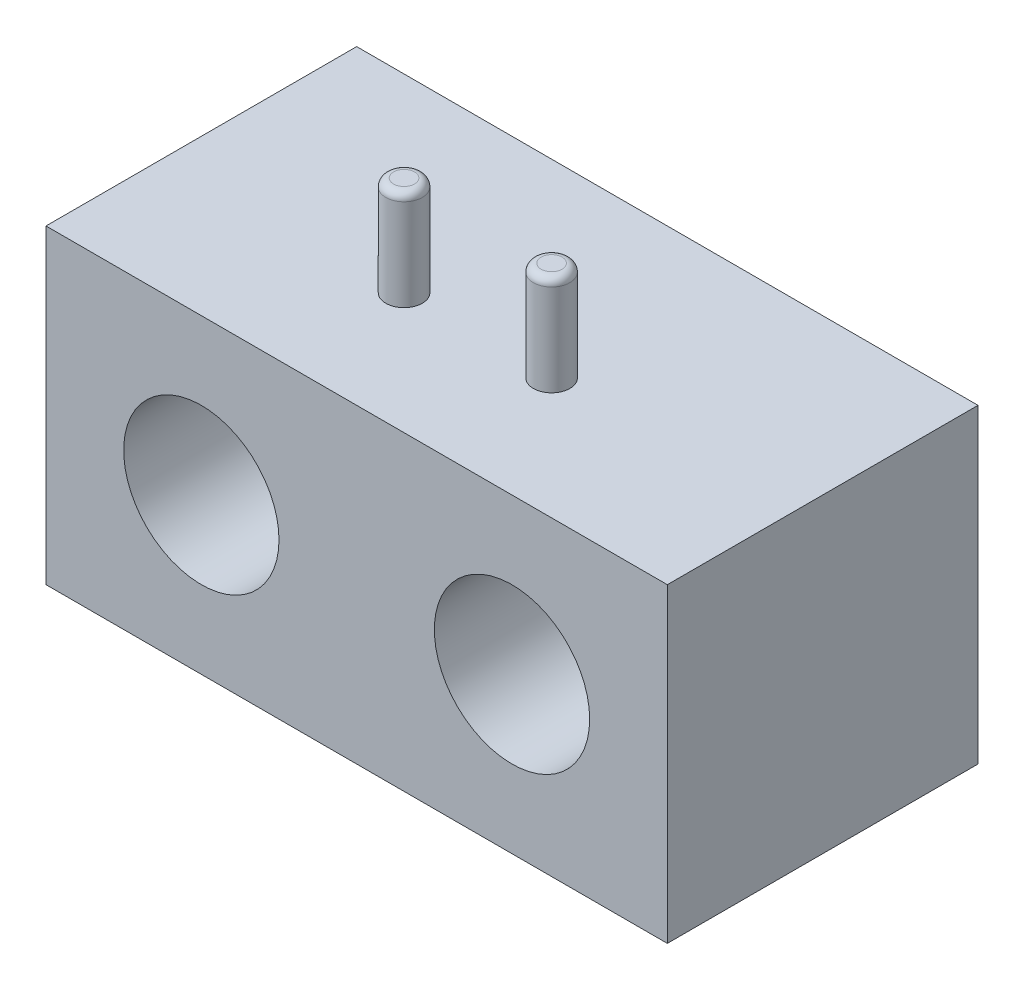
ISO-10303-21;
HEADER;
FILE_DESCRIPTION(('STEP AP214'),'2;1');
FILE_NAME('part.step','',(''),(''),'','','');
FILE_SCHEMA(('AUTOMOTIVE_DESIGN { 1 0 10303 214 1 1 1 1 }'));
ENDSEC;
DATA;
#1=APPLICATION_CONTEXT('core data for automotive mechanical design processes');
#2=APPLICATION_PROTOCOL_DEFINITION('international standard','automotive_design',2000,#1);
#3=PRODUCT_CONTEXT('',#1,'mechanical');
#4=PRODUCT('Part','Part','',(#3));
#5=PRODUCT_RELATED_PRODUCT_CATEGORY('part','',(#4));
#6=PRODUCT_DEFINITION_FORMATION('','',#4);
#7=PRODUCT_DEFINITION_CONTEXT('part definition',#1,'design');
#8=PRODUCT_DEFINITION('design','',#6,#7);
#9=PRODUCT_DEFINITION_SHAPE('','',#8);
#10=(LENGTH_UNIT() NAMED_UNIT(*) SI_UNIT(.MILLI.,.METRE.));
#11=(NAMED_UNIT(*) PLANE_ANGLE_UNIT() SI_UNIT($,.RADIAN.));
#12=(NAMED_UNIT(*) SI_UNIT($,.STERADIAN.) SOLID_ANGLE_UNIT());
#13=UNCERTAINTY_MEASURE_WITH_UNIT(LENGTH_MEASURE(1.E-05),#10,'distance_accuracy_value','');
#14=(GEOMETRIC_REPRESENTATION_CONTEXT(3) GLOBAL_UNCERTAINTY_ASSIGNED_CONTEXT((#13)) GLOBAL_UNIT_ASSIGNED_CONTEXT((#10,
#11,#12)) REPRESENTATION_CONTEXT('',''));
#15=CARTESIAN_POINT('',(0.,0.,0.));
#16=DIRECTION('',(0.,0.,1.));
#17=DIRECTION('',(1.,0.,0.));
#18=AXIS2_PLACEMENT_3D('',#15,#16,#17);
#19=CARTESIAN_POINT('',(-4.776,11.36,20.));
#20=DIRECTION('',(0.,0.,-1.));
#21=DIRECTION('',(-1.,0.,0.));
#22=AXIS2_PLACEMENT_3D('',#19,#20,#21);
#23=CYLINDRICAL_SURFACE('',#22,2.5);
#24=CARTESIAN_POINT('',(-4.776,11.36,0.));
#25=DIRECTION('',(0.,0.,1.));
#26=DIRECTION('',(1.,0.,0.));
#27=AXIS2_PLACEMENT_3D('',#24,#25,#26);
#28=CIRCLE('',#27,2.5);
#29=CARTESIAN_POINT('',(-2.276,11.36,0.));
#30=VERTEX_POINT('',#29);
#31=EDGE_CURVE('E118',#30,#30,#28,.T.);
#32=ORIENTED_EDGE('',*,*,#31,.F.);
#33=EDGE_LOOP('',(#32));
#34=FACE_BOUND('',#33,.T.);
#35=CARTESIAN_POINT('',(-4.776,11.36,2.));
#36=DIRECTION('',(0.,0.,1.));
#37=DIRECTION('',(1.,0.,0.));
#38=AXIS2_PLACEMENT_3D('',#35,#36,#37);
#39=CIRCLE('',#38,2.5);
#40=CARTESIAN_POINT('',(-2.276,11.36,2.));
#41=VERTEX_POINT('',#40);
#42=EDGE_CURVE('E136',#41,#41,#39,.T.);
#43=ORIENTED_EDGE('',*,*,#42,.T.);
#44=EDGE_LOOP('',(#43));
#45=FACE_BOUND('',#44,.T.);
#46=ADVANCED_FACE('F41',(#34,#45),#23,.F.);
#47=CARTESIAN_POINT('',(15.224,11.36,20.));
#48=DIRECTION('',(0.,0.,-1.));
#49=DIRECTION('',(-1.,0.,0.));
#50=AXIS2_PLACEMENT_3D('',#47,#48,#49);
#51=CYLINDRICAL_SURFACE('',#50,2.5);
#52=CARTESIAN_POINT('',(15.224,11.36,0.));
#53=DIRECTION('',(0.,0.,1.));
#54=DIRECTION('',(1.,0.,0.));
#55=AXIS2_PLACEMENT_3D('',#52,#53,#54);
#56=CIRCLE('',#55,2.5);
#57=CARTESIAN_POINT('',(17.724,11.36,0.));
#58=VERTEX_POINT('',#57);
#59=EDGE_CURVE('E141',#58,#58,#56,.T.);
#60=ORIENTED_EDGE('',*,*,#59,.F.);
#61=EDGE_LOOP('',(#60));
#62=FACE_BOUND('',#61,.T.);
#63=CARTESIAN_POINT('',(15.224,11.36,2.));
#64=DIRECTION('',(0.,0.,1.));
#65=DIRECTION('',(1.,0.,0.));
#66=AXIS2_PLACEMENT_3D('',#63,#64,#65);
#67=CIRCLE('',#66,2.5);
#68=CARTESIAN_POINT('',(17.724,11.36,2.));
#69=VERTEX_POINT('',#68);
#70=EDGE_CURVE('E132',#69,#69,#67,.T.);
#71=ORIENTED_EDGE('',*,*,#70,.T.);
#72=EDGE_LOOP('',(#71));
#73=FACE_BOUND('',#72,.T.);
#74=ADVANCED_FACE('F172',(#62,#73),#51,.F.);
#75=CARTESIAN_POINT('',(0.,0.,20.));
#76=DIRECTION('',(0.,0.,1.));
#77=DIRECTION('',(1.,0.,0.));
#78=AXIS2_PLACEMENT_3D('',#75,#76,#77);
#79=PLANE('',#78);
#80=CARTESIAN_POINT('',(-4.776,11.36,20.));
#81=DIRECTION('',(0.,0.,1.));
#82=DIRECTION('',(1.,0.,0.));
#83=AXIS2_PLACEMENT_3D('',#80,#81,#82);
#84=CIRCLE('',#83,5.);
#85=CARTESIAN_POINT('',(0.223999999999997,11.36,20.));
#86=VERTEX_POINT('',#85);
#87=EDGE_CURVE('E221',#86,#86,#84,.T.);
#88=ORIENTED_EDGE('',*,*,#87,.F.);
#89=EDGE_LOOP('',(#88));
#90=FACE_BOUND('',#89,.T.);
#91=CARTESIAN_POINT('',(15.224,11.36,20.));
#92=DIRECTION('',(0.,0.,1.));
#93=DIRECTION('',(1.,0.,0.));
#94=AXIS2_PLACEMENT_3D('',#91,#92,#93);
#95=CIRCLE('',#94,5.);
#96=CARTESIAN_POINT('',(20.224,11.36,20.));
#97=VERTEX_POINT('',#96);
#98=EDGE_CURVE('E222',#97,#97,#95,.T.);
#99=ORIENTED_EDGE('',*,*,#98,.F.);
#100=EDGE_LOOP('',(#99));
#101=FACE_BOUND('',#100,.T.);
#102=DIRECTION('',(0.,-1.,0.));
#103=VECTOR('',#102,1.);
#104=CARTESIAN_POINT('',(-14.776,21.36,20.));
#105=LINE('',#104,#103);
#106=CARTESIAN_POINT('',(-14.776,21.36,20.));
#107=VERTEX_POINT('',#106);
#108=CARTESIAN_POINT('',(-14.776,1.36,20.));
#109=VERTEX_POINT('',#108);
#110=EDGE_CURVE('E95',#107,#109,#105,.T.);
#111=ORIENTED_EDGE('',*,*,#110,.T.);
#112=DIRECTION('',(1.,0.,0.));
#113=VECTOR('',#112,1.);
#114=CARTESIAN_POINT('',(-14.776,1.36,20.));
#115=LINE('',#114,#113);
#116=CARTESIAN_POINT('',(25.224,1.36,20.));
#117=VERTEX_POINT('',#116);
#118=EDGE_CURVE('E90',#109,#117,#115,.T.);
#119=ORIENTED_EDGE('',*,*,#118,.T.);
#120=DIRECTION('',(0.,1.,0.));
#121=VECTOR('',#120,1.);
#122=CARTESIAN_POINT('',(25.224,21.36,20.));
#123=LINE('',#122,#121);
#124=CARTESIAN_POINT('',(25.224,21.36,20.));
#125=VERTEX_POINT('',#124);
#126=EDGE_CURVE('E93',#117,#125,#123,.T.);
#127=ORIENTED_EDGE('',*,*,#126,.T.);
#128=DIRECTION('',(-1.,0.,0.));
#129=VECTOR('',#128,1.);
#130=CARTESIAN_POINT('',(-14.776,21.36,20.));
#131=LINE('',#130,#129);
#132=EDGE_CURVE('E59',#125,#107,#131,.T.);
#133=ORIENTED_EDGE('',*,*,#132,.T.);
#134=EDGE_LOOP('',(#111,#119,#127,#133));
#135=FACE_BOUND('',#134,.T.);
#136=ADVANCED_FACE('F91',(#90,#101,#135),#79,.T.);
#137=CARTESIAN_POINT('',(0.,0.,0.));
#138=DIRECTION('',(0.,0.,1.));
#139=DIRECTION('',(1.,0.,0.));
#140=AXIS2_PLACEMENT_3D('',#137,#138,#139);
#141=PLANE('',#140);
#142=DIRECTION('',(0.,-1.,0.));
#143=VECTOR('',#142,1.);
#144=CARTESIAN_POINT('',(-14.776,21.36,0.));
#145=LINE('',#144,#143);
#146=CARTESIAN_POINT('',(-14.776,21.36,0.));
#147=VERTEX_POINT('',#146);
#148=CARTESIAN_POINT('',(-14.776,1.36,0.));
#149=VERTEX_POINT('',#148);
#150=EDGE_CURVE('E114',#147,#149,#145,.T.);
#151=ORIENTED_EDGE('',*,*,#150,.F.);
#152=DIRECTION('',(-1.,0.,0.));
#153=VECTOR('',#152,1.);
#154=CARTESIAN_POINT('',(-14.776,21.36,0.));
#155=LINE('',#154,#153);
#156=CARTESIAN_POINT('',(25.224,21.36,0.));
#157=VERTEX_POINT('',#156);
#158=EDGE_CURVE('E82',#157,#147,#155,.T.);
#159=ORIENTED_EDGE('',*,*,#158,.F.);
#160=DIRECTION('',(0.,1.,0.));
#161=VECTOR('',#160,1.);
#162=CARTESIAN_POINT('',(25.224,21.36,0.));
#163=LINE('',#162,#161);
#164=CARTESIAN_POINT('',(25.224,1.36,0.));
#165=VERTEX_POINT('',#164);
#166=EDGE_CURVE('E76',#165,#157,#163,.T.);
#167=ORIENTED_EDGE('',*,*,#166,.F.);
#168=DIRECTION('',(1.,0.,0.));
#169=VECTOR('',#168,1.);
#170=CARTESIAN_POINT('',(-14.776,1.36,0.));
#171=LINE('',#170,#169);
#172=EDGE_CURVE('E101',#149,#165,#171,.T.);
#173=ORIENTED_EDGE('',*,*,#172,.F.);
#174=EDGE_LOOP('',(#151,#159,#167,#173));
#175=FACE_BOUND('',#174,.T.);
#176=ORIENTED_EDGE('',*,*,#31,.T.);
#177=EDGE_LOOP('',(#176));
#178=FACE_BOUND('',#177,.T.);
#179=ORIENTED_EDGE('',*,*,#59,.T.);
#180=EDGE_LOOP('',(#179));
#181=FACE_BOUND('',#180,.T.);
#182=ADVANCED_FACE('F186',(#175,#178,#181),#141,.F.);
#183=CARTESIAN_POINT('',(-14.776,21.36,20.));
#184=DIRECTION('',(1.,0.,0.));
#185=DIRECTION('',(0.,1.,0.));
#186=AXIS2_PLACEMENT_3D('',#183,#184,#185);
#187=PLANE('',#186);
#188=ORIENTED_EDGE('',*,*,#150,.T.);
#189=DIRECTION('',(0.,0.,-1.));
#190=VECTOR('',#189,1.);
#191=CARTESIAN_POINT('',(-14.776,1.36,20.));
#192=LINE('',#191,#190);
#193=EDGE_CURVE('E103',#109,#149,#192,.T.);
#194=ORIENTED_EDGE('',*,*,#193,.F.);
#195=ORIENTED_EDGE('',*,*,#110,.F.);
#196=DIRECTION('',(0.,0.,-1.));
#197=VECTOR('',#196,1.);
#198=CARTESIAN_POINT('',(-14.776,21.36,20.));
#199=LINE('',#198,#197);
#200=EDGE_CURVE('E110',#107,#147,#199,.T.);
#201=ORIENTED_EDGE('',*,*,#200,.T.);
#202=EDGE_LOOP('',(#188,#194,#195,#201));
#203=FACE_BOUND('',#202,.T.);
#204=ADVANCED_FACE('F190',(#203),#187,.F.);
#205=CARTESIAN_POINT('',(-14.776,1.36,20.));
#206=DIRECTION('',(0.,1.,0.));
#207=DIRECTION('',(0.,0.,1.));
#208=AXIS2_PLACEMENT_3D('',#205,#206,#207);
#209=PLANE('',#208);
#210=ORIENTED_EDGE('',*,*,#172,.T.);
#211=DIRECTION('',(0.,0.,-1.));
#212=VECTOR('',#211,1.);
#213=CARTESIAN_POINT('',(25.224,1.36,20.));
#214=LINE('',#213,#212);
#215=EDGE_CURVE('E99',#117,#165,#214,.T.);
#216=ORIENTED_EDGE('',*,*,#215,.F.);
#217=ORIENTED_EDGE('',*,*,#118,.F.);
#218=ORIENTED_EDGE('',*,*,#193,.T.);
#219=EDGE_LOOP('',(#210,#216,#217,#218));
#220=FACE_BOUND('',#219,.T.);
#221=ADVANCED_FACE('F100',(#220),#209,.F.);
#222=CARTESIAN_POINT('',(25.224,21.36,20.));
#223=DIRECTION('',(-1.,0.,0.));
#224=DIRECTION('',(0.,-1.,0.));
#225=AXIS2_PLACEMENT_3D('',#222,#223,#224);
#226=PLANE('',#225);
#227=ORIENTED_EDGE('',*,*,#166,.T.);
#228=DIRECTION('',(0.,0.,-1.));
#229=VECTOR('',#228,1.);
#230=CARTESIAN_POINT('',(25.224,21.36,20.));
#231=LINE('',#230,#229);
#232=EDGE_CURVE('E104',#125,#157,#231,.T.);
#233=ORIENTED_EDGE('',*,*,#232,.F.);
#234=ORIENTED_EDGE('',*,*,#126,.F.);
#235=ORIENTED_EDGE('',*,*,#215,.T.);
#236=EDGE_LOOP('',(#227,#233,#234,#235));
#237=FACE_BOUND('',#236,.T.);
#238=ADVANCED_FACE('F106',(#237),#226,.F.);
#239=CARTESIAN_POINT('',(-14.776,21.36,20.));
#240=DIRECTION('',(0.,-1.,0.));
#241=DIRECTION('',(0.,0.,-1.));
#242=AXIS2_PLACEMENT_3D('',#239,#240,#241);
#243=PLANE('',#242);
#244=CARTESIAN_POINT('',(0.473999999999995,21.36,12.2));
#245=DIRECTION('',(0.,-1.,0.));
#246=DIRECTION('',(0.,0.,-1.));
#247=AXIS2_PLACEMENT_3D('',#244,#245,#246);
#248=CIRCLE('',#247,1.175);
#249=CARTESIAN_POINT('',(0.473999999999995,21.36,11.025));
#250=VERTEX_POINT('',#249);
#251=EDGE_CURVE('E145',#250,#250,#248,.F.);
#252=ORIENTED_EDGE('',*,*,#251,.F.);
#253=EDGE_LOOP('',(#252));
#254=FACE_BOUND('',#253,.T.);
#255=CARTESIAN_POINT('',(9.974,21.36,12.2));
#256=DIRECTION('',(0.,-1.,0.));
#257=DIRECTION('',(0.,0.,-1.));
#258=AXIS2_PLACEMENT_3D('',#255,#256,#257);
#259=CIRCLE('',#258,1.175);
#260=CARTESIAN_POINT('',(9.974,21.36,11.025));
#261=VERTEX_POINT('',#260);
#262=EDGE_CURVE('E131',#261,#261,#259,.F.);
#263=ORIENTED_EDGE('',*,*,#262,.F.);
#264=EDGE_LOOP('',(#263));
#265=FACE_BOUND('',#264,.T.);
#266=ORIENTED_EDGE('',*,*,#158,.T.);
#267=ORIENTED_EDGE('',*,*,#200,.F.);
#268=ORIENTED_EDGE('',*,*,#132,.F.);
#269=ORIENTED_EDGE('',*,*,#232,.T.);
#270=EDGE_LOOP('',(#266,#267,#268,#269));
#271=FACE_BOUND('',#270,.T.);
#272=ADVANCED_FACE('F192',(#254,#265,#271),#243,.F.);
#273=CARTESIAN_POINT('',(15.224,11.36,-14.142135623731));
#274=DIRECTION('',(0.,0.,1.));
#275=DIRECTION('',(1.,0.,0.));
#276=AXIS2_PLACEMENT_3D('',#273,#274,#275);
#277=CYLINDRICAL_SURFACE('',#276,5.);
#278=CARTESIAN_POINT('',(15.224,11.36,2.));
#279=DIRECTION('',(0.,0.,1.));
#280=DIRECTION('',(1.,0.,0.));
#281=AXIS2_PLACEMENT_3D('',#278,#279,#280);
#282=CIRCLE('',#281,5.);
#283=CARTESIAN_POINT('',(20.224,11.36,1.99999999999999));
#284=VERTEX_POINT('',#283);
#285=EDGE_CURVE('E216',#284,#284,#282,.F.);
#286=CARTESIAN_POINT('',(20.224,11.36,1.99999999999999));
#287=CARTESIAN_POINT('',(20.224,11.36,2.1875));
#288=CARTESIAN_POINT('',(20.224,11.36,2.375));
#289=CARTESIAN_POINT('',(20.224,11.36,2.75));
#290=CARTESIAN_POINT('',(20.224,11.36,2.9375));
#291=CARTESIAN_POINT('',(20.224,11.36,3.3125));
#292=CARTESIAN_POINT('',(20.224,11.36,3.5));
#293=CARTESIAN_POINT('',(20.224,11.36,3.875));
#294=CARTESIAN_POINT('',(20.224,11.36,4.0625));
#295=CARTESIAN_POINT('',(20.224,11.36,4.4375));
#296=CARTESIAN_POINT('',(20.224,11.36,4.62499999999999));
#297=CARTESIAN_POINT('',(20.224,11.36,4.99999999999999));
#298=CARTESIAN_POINT('',(20.224,11.36,5.18749999999999));
#299=CARTESIAN_POINT('',(20.224,11.36,5.56249999999999));
#300=CARTESIAN_POINT('',(20.224,11.36,5.74999999999999));
#301=CARTESIAN_POINT('',(20.224,11.36,6.12499999999999));
#302=CARTESIAN_POINT('',(20.224,11.36,6.3125));
#303=CARTESIAN_POINT('',(20.224,11.36,6.6875));
#304=CARTESIAN_POINT('',(20.224,11.36,6.875));
#305=CARTESIAN_POINT('',(20.224,11.36,7.25));
#306=CARTESIAN_POINT('',(20.224,11.36,7.4375));
#307=CARTESIAN_POINT('',(20.224,11.36,7.8125));
#308=CARTESIAN_POINT('',(20.224,11.36,7.99999999999999));
#309=CARTESIAN_POINT('',(20.224,11.36,8.37499999999999));
#310=CARTESIAN_POINT('',(20.224,11.36,8.56249999999999));
#311=CARTESIAN_POINT('',(20.224,11.36,8.93749999999999));
#312=CARTESIAN_POINT('',(20.224,11.36,9.12499999999999));
#313=CARTESIAN_POINT('',(20.224,11.36,9.49999999999999));
#314=CARTESIAN_POINT('',(20.224,11.36,9.68749999999999));
#315=CARTESIAN_POINT('',(20.224,11.36,10.0625));
#316=CARTESIAN_POINT('',(20.224,11.36,10.25));
#317=CARTESIAN_POINT('',(20.224,11.36,10.625));
#318=CARTESIAN_POINT('',(20.224,11.36,10.8125));
#319=CARTESIAN_POINT('',(20.224,11.36,11.1875));
#320=CARTESIAN_POINT('',(20.224,11.36,11.375));
#321=CARTESIAN_POINT('',(20.224,11.36,11.75));
#322=CARTESIAN_POINT('',(20.224,11.36,11.9375));
#323=CARTESIAN_POINT('',(20.224,11.36,12.3125));
#324=CARTESIAN_POINT('',(20.224,11.36,12.5));
#325=CARTESIAN_POINT('',(20.224,11.36,12.875));
#326=CARTESIAN_POINT('',(20.224,11.36,13.0625));
#327=CARTESIAN_POINT('',(20.224,11.36,13.4375));
#328=CARTESIAN_POINT('',(20.224,11.36,13.625));
#329=CARTESIAN_POINT('',(20.224,11.36,14.));
#330=CARTESIAN_POINT('',(20.224,11.36,14.1875));
#331=CARTESIAN_POINT('',(20.224,11.36,14.5625));
#332=CARTESIAN_POINT('',(20.224,11.36,14.75));
#333=CARTESIAN_POINT('',(20.224,11.36,15.125));
#334=CARTESIAN_POINT('',(20.224,11.36,15.3125));
#335=CARTESIAN_POINT('',(20.224,11.36,15.6875));
#336=CARTESIAN_POINT('',(20.224,11.36,15.875));
#337=CARTESIAN_POINT('',(20.224,11.36,16.25));
#338=CARTESIAN_POINT('',(20.224,11.36,16.4375));
#339=CARTESIAN_POINT('',(20.224,11.36,16.8125));
#340=CARTESIAN_POINT('',(20.224,11.36,17.));
#341=CARTESIAN_POINT('',(20.224,11.36,17.375));
#342=CARTESIAN_POINT('',(20.224,11.36,17.5625));
#343=CARTESIAN_POINT('',(20.224,11.36,17.9375));
#344=CARTESIAN_POINT('',(20.224,11.36,18.125));
#345=CARTESIAN_POINT('',(20.224,11.36,18.5));
#346=CARTESIAN_POINT('',(20.224,11.36,18.6875));
#347=CARTESIAN_POINT('',(20.224,11.36,19.0625));
#348=CARTESIAN_POINT('',(20.224,11.36,19.25));
#349=CARTESIAN_POINT('',(20.224,11.36,19.625));
#350=CARTESIAN_POINT('',(20.224,11.36,19.8125));
#351=CARTESIAN_POINT('',(20.224,11.36,20.));
#352=B_SPLINE_CURVE_WITH_KNOTS('',3,(#286,#287,#288,#289,#290,#291,#292,#293,#294,#295,#296,
#297,#298,#299,#300,#301,#302,#303,#304,#305,#306,#307,#308,#309,#310,#311,#312,#313,#314,#315,
#316,#317,#318,#319,#320,#321,#322,#323,#324,#325,#326,#327,#328,#329,#330,#331,#332,#333,#334,
#335,#336,#337,#338,#339,#340,#341,#342,#343,#344,#345,#346,#347,#348,#349,#350,#351),
.UNSPECIFIED.,.F.,.F.,(4,2,2,2,2,2,2,2,2,2,2,2,2,2,2,2,2,2,2,2,2,2,2,2,2,2,2,2,2,2,2,2,4),(0.,
0.5625,1.125,1.6875,2.25,2.8125,3.375,3.9375,4.5,5.0625,5.625,6.1875,6.75,7.3125,7.875,8.4375,
9.,9.5625,10.125,10.6875,11.25,11.8125,12.375,12.9375,13.5,14.0625,14.625,15.1875,15.75,16.3125,
16.875,17.4375,18.),.UNSPECIFIED.);
#353=EDGE_CURVE('BSEAM195',#284,#97,#352,.T.);
#354=ORIENTED_EDGE('',*,*,#285,.T.);
#355=ORIENTED_EDGE('',*,*,#98,.T.);
#356=ORIENTED_EDGE('',*,*,#353,.T.);
#357=ORIENTED_EDGE('',*,*,#353,.F.);
#358=EDGE_LOOP('',(#354,#356,#355,#357));
#359=FACE_BOUND('',#358,.T.);
#360=ADVANCED_FACE('F195',(#359),#277,.F.);
#361=CARTESIAN_POINT('',(0.,0.,2.));
#362=DIRECTION('',(0.,0.,1.));
#363=DIRECTION('',(1.,0.,0.));
#364=AXIS2_PLACEMENT_3D('',#361,#362,#363);
#365=PLANE('',#364);
#366=ORIENTED_EDGE('',*,*,#70,.F.);
#367=EDGE_LOOP('',(#366));
#368=FACE_BOUND('',#367,.T.);
#369=ORIENTED_EDGE('',*,*,#285,.F.);
#370=EDGE_LOOP('',(#369));
#371=FACE_BOUND('',#370,.T.);
#372=ADVANCED_FACE('F238',(#368,#371),#365,.T.);
#373=CARTESIAN_POINT('',(-4.776,11.36,-14.142135623731));
#374=DIRECTION('',(0.,0.,1.));
#375=DIRECTION('',(1.,0.,0.));
#376=AXIS2_PLACEMENT_3D('',#373,#374,#375);
#377=CYLINDRICAL_SURFACE('',#376,5.);
#378=CARTESIAN_POINT('',(-4.776,11.36,2.));
#379=DIRECTION('',(0.,0.,1.));
#380=DIRECTION('',(1.,0.,0.));
#381=AXIS2_PLACEMENT_3D('',#378,#379,#380);
#382=CIRCLE('',#381,5.);
#383=CARTESIAN_POINT('',(0.223999999999997,11.36,1.99999999999999));
#384=VERTEX_POINT('',#383);
#385=EDGE_CURVE('E137',#384,#384,#382,.F.);
#386=CARTESIAN_POINT('',(0.223999999999997,11.36,1.99999999999999));
#387=CARTESIAN_POINT('',(0.223999999999997,11.36,2.1875));
#388=CARTESIAN_POINT('',(0.223999999999997,11.36,2.375));
#389=CARTESIAN_POINT('',(0.223999999999997,11.36,2.75));
#390=CARTESIAN_POINT('',(0.223999999999997,11.36,2.9375));
#391=CARTESIAN_POINT('',(0.223999999999997,11.36,3.3125));
#392=CARTESIAN_POINT('',(0.223999999999997,11.36,3.5));
#393=CARTESIAN_POINT('',(0.223999999999997,11.36,3.875));
#394=CARTESIAN_POINT('',(0.223999999999997,11.36,4.0625));
#395=CARTESIAN_POINT('',(0.223999999999997,11.36,4.4375));
#396=CARTESIAN_POINT('',(0.223999999999997,11.36,4.62499999999999));
#397=CARTESIAN_POINT('',(0.223999999999997,11.36,4.99999999999999));
#398=CARTESIAN_POINT('',(0.223999999999997,11.36,5.18749999999999));
#399=CARTESIAN_POINT('',(0.223999999999997,11.36,5.56249999999999));
#400=CARTESIAN_POINT('',(0.223999999999997,11.36,5.74999999999999));
#401=CARTESIAN_POINT('',(0.223999999999997,11.36,6.12499999999999));
#402=CARTESIAN_POINT('',(0.223999999999997,11.36,6.3125));
#403=CARTESIAN_POINT('',(0.223999999999997,11.36,6.6875));
#404=CARTESIAN_POINT('',(0.223999999999997,11.36,6.875));
#405=CARTESIAN_POINT('',(0.223999999999997,11.36,7.25));
#406=CARTESIAN_POINT('',(0.223999999999997,11.36,7.4375));
#407=CARTESIAN_POINT('',(0.223999999999997,11.36,7.8125));
#408=CARTESIAN_POINT('',(0.223999999999997,11.36,7.99999999999999));
#409=CARTESIAN_POINT('',(0.223999999999997,11.36,8.37499999999999));
#410=CARTESIAN_POINT('',(0.223999999999997,11.36,8.56249999999999));
#411=CARTESIAN_POINT('',(0.223999999999997,11.36,8.93749999999999));
#412=CARTESIAN_POINT('',(0.223999999999997,11.36,9.12499999999999));
#413=CARTESIAN_POINT('',(0.223999999999997,11.36,9.49999999999999));
#414=CARTESIAN_POINT('',(0.223999999999997,11.36,9.68749999999999));
#415=CARTESIAN_POINT('',(0.223999999999997,11.36,10.0625));
#416=CARTESIAN_POINT('',(0.223999999999997,11.36,10.25));
#417=CARTESIAN_POINT('',(0.223999999999997,11.36,10.625));
#418=CARTESIAN_POINT('',(0.223999999999997,11.36,10.8125));
#419=CARTESIAN_POINT('',(0.223999999999997,11.36,11.1875));
#420=CARTESIAN_POINT('',(0.223999999999997,11.36,11.375));
#421=CARTESIAN_POINT('',(0.223999999999997,11.36,11.75));
#422=CARTESIAN_POINT('',(0.223999999999997,11.36,11.9375));
#423=CARTESIAN_POINT('',(0.223999999999997,11.36,12.3125));
#424=CARTESIAN_POINT('',(0.223999999999997,11.36,12.5));
#425=CARTESIAN_POINT('',(0.223999999999997,11.36,12.875));
#426=CARTESIAN_POINT('',(0.223999999999997,11.36,13.0625));
#427=CARTESIAN_POINT('',(0.223999999999997,11.36,13.4375));
#428=CARTESIAN_POINT('',(0.223999999999997,11.36,13.625));
#429=CARTESIAN_POINT('',(0.223999999999997,11.36,14.));
#430=CARTESIAN_POINT('',(0.223999999999997,11.36,14.1875));
#431=CARTESIAN_POINT('',(0.223999999999997,11.36,14.5625));
#432=CARTESIAN_POINT('',(0.223999999999997,11.36,14.75));
#433=CARTESIAN_POINT('',(0.223999999999997,11.36,15.125));
#434=CARTESIAN_POINT('',(0.223999999999997,11.36,15.3125));
#435=CARTESIAN_POINT('',(0.223999999999997,11.36,15.6875));
#436=CARTESIAN_POINT('',(0.223999999999997,11.36,15.875));
#437=CARTESIAN_POINT('',(0.223999999999997,11.36,16.25));
#438=CARTESIAN_POINT('',(0.223999999999997,11.36,16.4375));
#439=CARTESIAN_POINT('',(0.223999999999997,11.36,16.8125));
#440=CARTESIAN_POINT('',(0.223999999999997,11.36,17.));
#441=CARTESIAN_POINT('',(0.223999999999997,11.36,17.375));
#442=CARTESIAN_POINT('',(0.223999999999997,11.36,17.5625));
#443=CARTESIAN_POINT('',(0.223999999999997,11.36,17.9375));
#444=CARTESIAN_POINT('',(0.223999999999997,11.36,18.125));
#445=CARTESIAN_POINT('',(0.223999999999997,11.36,18.5));
#446=CARTESIAN_POINT('',(0.223999999999997,11.36,18.6875));
#447=CARTESIAN_POINT('',(0.223999999999997,11.36,19.0625));
#448=CARTESIAN_POINT('',(0.223999999999997,11.36,19.25));
#449=CARTESIAN_POINT('',(0.223999999999997,11.36,19.625));
#450=CARTESIAN_POINT('',(0.223999999999997,11.36,19.8125));
#451=CARTESIAN_POINT('',(0.223999999999997,11.36,20.));
#452=B_SPLINE_CURVE_WITH_KNOTS('',3,(#386,#387,#388,#389,#390,#391,#392,#393,#394,#395,#396,
#397,#398,#399,#400,#401,#402,#403,#404,#405,#406,#407,#408,#409,#410,#411,#412,#413,#414,#415,
#416,#417,#418,#419,#420,#421,#422,#423,#424,#425,#426,#427,#428,#429,#430,#431,#432,#433,#434,
#435,#436,#437,#438,#439,#440,#441,#442,#443,#444,#445,#446,#447,#448,#449,#450,#451),
.UNSPECIFIED.,.F.,.F.,(4,2,2,2,2,2,2,2,2,2,2,2,2,2,2,2,2,2,2,2,2,2,2,2,2,2,2,2,2,2,2,2,4),(0.,
0.5625,1.125,1.6875,2.25,2.8125,3.375,3.9375,4.5,5.0625,5.625,6.1875,6.75,7.3125,7.875,8.4375,
9.,9.5625,10.125,10.6875,11.25,11.8125,12.375,12.9375,13.5,14.0625,14.625,15.1875,15.75,16.3125,
16.875,17.4375,18.),.UNSPECIFIED.);
#453=EDGE_CURVE('BSEAM233',#384,#86,#452,.T.);
#454=ORIENTED_EDGE('',*,*,#385,.T.);
#455=ORIENTED_EDGE('',*,*,#87,.T.);
#456=ORIENTED_EDGE('',*,*,#453,.T.);
#457=ORIENTED_EDGE('',*,*,#453,.F.);
#458=EDGE_LOOP('',(#454,#456,#455,#457));
#459=FACE_BOUND('',#458,.T.);
#460=ADVANCED_FACE('F233',(#459),#377,.F.);
#461=CARTESIAN_POINT('',(0.,0.,2.));
#462=DIRECTION('',(0.,0.,1.));
#463=DIRECTION('',(1.,0.,0.));
#464=AXIS2_PLACEMENT_3D('',#461,#462,#463);
#465=PLANE('',#464);
#466=ORIENTED_EDGE('',*,*,#42,.F.);
#467=EDGE_LOOP('',(#466));
#468=FACE_BOUND('',#467,.T.);
#469=ORIENTED_EDGE('',*,*,#385,.F.);
#470=EDGE_LOOP('',(#469));
#471=FACE_BOUND('',#470,.T.);
#472=ADVANCED_FACE('F248',(#468,#471),#465,.T.);
#473=CARTESIAN_POINT('',(9.974,27.76,12.2));
#474=DIRECTION('',(0.,-1.,0.));
#475=DIRECTION('',(0.,0.,-1.));
#476=AXIS2_PLACEMENT_3D('',#473,#474,#475);
#477=CYLINDRICAL_SURFACE('',#476,1.175);
#478=CARTESIAN_POINT('',(9.974,27.26,12.2));
#479=DIRECTION('',(0.,1.,0.));
#480=DIRECTION('',(0.,0.,1.));
#481=AXIS2_PLACEMENT_3D('',#478,#479,#480);
#482=CIRCLE('',#481,1.175);
#483=CARTESIAN_POINT('',(9.974,27.26,13.375));
#484=VERTEX_POINT('',#483);
#485=EDGE_CURVE('E12',#484,#484,#482,.F.);
#486=ORIENTED_EDGE('',*,*,#485,.T.);
#487=EDGE_LOOP('',(#486));
#488=FACE_BOUND('',#487,.T.);
#489=ORIENTED_EDGE('',*,*,#262,.T.);
#490=EDGE_LOOP('',(#489));
#491=FACE_BOUND('',#490,.T.);
#492=ADVANCED_FACE('F252',(#488,#491),#477,.T.);
#493=CARTESIAN_POINT('',(9.974,27.76,12.2));
#494=DIRECTION('',(0.,1.,0.));
#495=DIRECTION('',(0.,0.,1.));
#496=AXIS2_PLACEMENT_3D('',#493,#494,#495);
#497=PLANE('',#496);
#498=CARTESIAN_POINT('',(9.974,27.76,12.2));
#499=DIRECTION('',(0.,1.,0.));
#500=DIRECTION('',(0.,0.,1.));
#501=AXIS2_PLACEMENT_3D('',#498,#499,#500);
#502=CIRCLE('',#501,0.675);
#503=CARTESIAN_POINT('',(9.974,27.76,12.875));
#504=VERTEX_POINT('',#503);
#505=EDGE_CURVE('E51',#504,#504,#502,.T.);
#506=ORIENTED_EDGE('',*,*,#505,.T.);
#507=EDGE_LOOP('',(#506));
#508=FACE_BOUND('',#507,.T.);
#509=ADVANCED_FACE('F160',(#508),#497,.T.);
#510=CARTESIAN_POINT('',(0.473999999999995,27.76,12.2));
#511=DIRECTION('',(0.,-1.,0.));
#512=DIRECTION('',(0.,0.,-1.));
#513=AXIS2_PLACEMENT_3D('',#510,#511,#512);
#514=CYLINDRICAL_SURFACE('',#513,1.175);
#515=CARTESIAN_POINT('',(0.473999999999995,27.26,12.2));
#516=DIRECTION('',(0.,1.,0.));
#517=DIRECTION('',(0.,0.,1.));
#518=AXIS2_PLACEMENT_3D('',#515,#516,#517);
#519=CIRCLE('',#518,1.175);
#520=CARTESIAN_POINT('',(0.473999999999995,27.26,13.375));
#521=VERTEX_POINT('',#520);
#522=EDGE_CURVE('E153',#521,#521,#519,.F.);
#523=ORIENTED_EDGE('',*,*,#522,.T.);
#524=EDGE_LOOP('',(#523));
#525=FACE_BOUND('',#524,.T.);
#526=ORIENTED_EDGE('',*,*,#251,.T.);
#527=EDGE_LOOP('',(#526));
#528=FACE_BOUND('',#527,.T.);
#529=ADVANCED_FACE('F259',(#525,#528),#514,.T.);
#530=CARTESIAN_POINT('',(0.473999999999995,27.76,12.2));
#531=DIRECTION('',(0.,1.,0.));
#532=DIRECTION('',(0.,0.,1.));
#533=AXIS2_PLACEMENT_3D('',#530,#531,#532);
#534=PLANE('',#533);
#535=CARTESIAN_POINT('',(0.473999999999995,27.76,12.2));
#536=DIRECTION('',(0.,1.,0.));
#537=DIRECTION('',(0.,0.,1.));
#538=AXIS2_PLACEMENT_3D('',#535,#536,#537);
#539=CIRCLE('',#538,0.675000000000001);
#540=CARTESIAN_POINT('',(0.473999999999995,27.76,12.875));
#541=VERTEX_POINT('',#540);
#542=EDGE_CURVE('E149',#541,#541,#539,.T.);
#543=ORIENTED_EDGE('',*,*,#542,.T.);
#544=EDGE_LOOP('',(#543));
#545=FACE_BOUND('',#544,.T.);
#546=ADVANCED_FACE('F168',(#545),#534,.T.);
#547=CARTESIAN_POINT('',(0.473999999999995,27.26,12.2));
#548=DIRECTION('',(0.,1.,0.));
#549=DIRECTION('',(0.,0.,1.));
#550=AXIS2_PLACEMENT_3D('',#547,#548,#549);
#551=TOROIDAL_SURFACE('',#550,0.675000000000001,0.5);
#552=ORIENTED_EDGE('',*,*,#522,.F.);
#553=EDGE_LOOP('',(#552));
#554=FACE_BOUND('',#553,.T.);
#555=ORIENTED_EDGE('',*,*,#542,.F.);
#556=EDGE_LOOP('',(#555));
#557=FACE_BOUND('',#556,.T.);
#558=ADVANCED_FACE('F163',(#554,#557),#551,.T.);
#559=CARTESIAN_POINT('',(9.974,27.26,12.2));
#560=DIRECTION('',(0.,1.,0.));
#561=DIRECTION('',(0.,0.,1.));
#562=AXIS2_PLACEMENT_3D('',#559,#560,#561);
#563=TOROIDAL_SURFACE('',#562,0.675,0.5);
#564=ORIENTED_EDGE('',*,*,#485,.F.);
#565=EDGE_LOOP('',(#564));
#566=FACE_BOUND('',#565,.T.);
#567=ORIENTED_EDGE('',*,*,#505,.F.);
#568=EDGE_LOOP('',(#567));
#569=FACE_BOUND('',#568,.T.);
#570=ADVANCED_FACE('F43',(#566,#569),#563,.T.);
#571=CLOSED_SHELL('',(#46,#74,#136,#182,#204,#221,#238,#272,#360,#372,#460,#472,#492,#509,#529,
#546,#558,#570));
#572=MANIFOLD_SOLID_BREP('B2',#571);
#573=ADVANCED_BREP_SHAPE_REPRESENTATION('',(#18,#572),#14);
#574=SHAPE_DEFINITION_REPRESENTATION(#9,#573);
ENDSEC;
END-ISO-10303-21;
